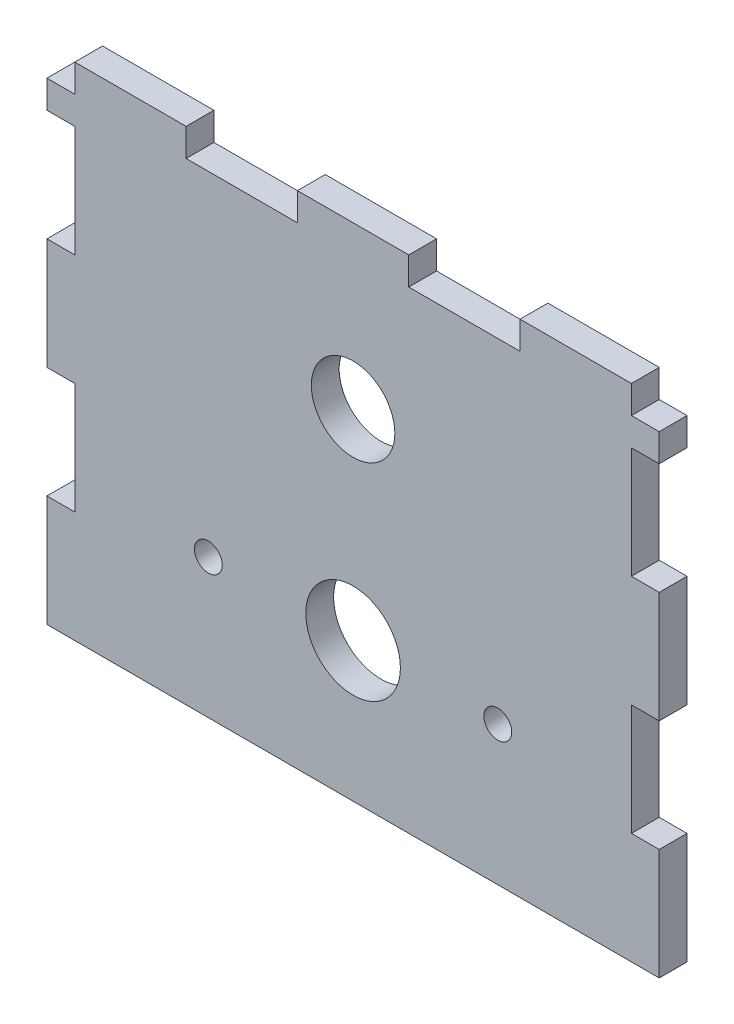
ISO-10303-21;
HEADER;
FILE_DESCRIPTION(('STEP AP214'),'2;1');
FILE_NAME('part.step','',(''),(''),'','','');
FILE_SCHEMA(('AUTOMOTIVE_DESIGN { 1 0 10303 214 1 1 1 1 }'));
ENDSEC;
DATA;
#1=APPLICATION_CONTEXT('core data for automotive mechanical design processes');
#2=APPLICATION_PROTOCOL_DEFINITION('international standard','automotive_design',2000,#1);
#3=PRODUCT_CONTEXT('',#1,'mechanical');
#4=PRODUCT('Part','Part','',(#3));
#5=PRODUCT_RELATED_PRODUCT_CATEGORY('part','',(#4));
#6=PRODUCT_DEFINITION_FORMATION('','',#4);
#7=PRODUCT_DEFINITION_CONTEXT('part definition',#1,'design');
#8=PRODUCT_DEFINITION('design','',#6,#7);
#9=PRODUCT_DEFINITION_SHAPE('','',#8);
#10=(LENGTH_UNIT() NAMED_UNIT(*) SI_UNIT(.MILLI.,.METRE.));
#11=(NAMED_UNIT(*) PLANE_ANGLE_UNIT() SI_UNIT($,.RADIAN.));
#12=(NAMED_UNIT(*) SI_UNIT($,.STERADIAN.) SOLID_ANGLE_UNIT());
#13=UNCERTAINTY_MEASURE_WITH_UNIT(LENGTH_MEASURE(1.E-05),#10,'distance_accuracy_value','');
#14=(GEOMETRIC_REPRESENTATION_CONTEXT(3) GLOBAL_UNCERTAINTY_ASSIGNED_CONTEXT((#13)) GLOBAL_UNIT_ASSIGNED_CONTEXT((#10,
#11,#12)) REPRESENTATION_CONTEXT('',''));
#15=CARTESIAN_POINT('',(0.,0.,0.));
#16=DIRECTION('',(0.,0.,1.));
#17=DIRECTION('',(1.,0.,0.));
#18=AXIS2_PLACEMENT_3D('',#15,#16,#17);
#19=CARTESIAN_POINT('',(-50.,42.5,5.));
#20=DIRECTION('',(1.,0.,0.));
#21=DIRECTION('',(0.,1.,0.));
#22=AXIS2_PLACEMENT_3D('',#19,#20,#21);
#23=PLANE('',#22);
#24=DIRECTION('',(0.,0.,1.));
#25=VECTOR('',#24,1.);
#26=CARTESIAN_POINT('',(-50.,42.5,-7.07106781186547));
#27=LINE('',#26,#25);
#28=CARTESIAN_POINT('',(-50.,42.5,0.));
#29=VERTEX_POINT('',#28);
#30=CARTESIAN_POINT('',(-50.,42.5,5.));
#31=VERTEX_POINT('',#30);
#32=EDGE_CURVE('E62',#29,#31,#27,.T.);
#33=ORIENTED_EDGE('',*,*,#32,.T.);
#34=DIRECTION('',(0.,-1.,0.));
#35=VECTOR('',#34,1.);
#36=CARTESIAN_POINT('',(-50.,42.5,5.));
#37=LINE('',#36,#35);
#38=CARTESIAN_POINT('',(-50.,47.5,5.));
#39=VERTEX_POINT('',#38);
#40=EDGE_CURVE('E46',#39,#31,#37,.T.);
#41=ORIENTED_EDGE('',*,*,#40,.F.);
#42=DIRECTION('',(0.,0.,1.));
#43=VECTOR('',#42,1.);
#44=CARTESIAN_POINT('',(-50.,47.5,-20.6155281280883));
#45=LINE('',#44,#43);
#46=CARTESIAN_POINT('',(-50.,47.5,0.));
#47=VERTEX_POINT('',#46);
#48=EDGE_CURVE('E314',#47,#39,#45,.T.);
#49=ORIENTED_EDGE('',*,*,#48,.F.);
#50=DIRECTION('',(0.,-1.,0.));
#51=VECTOR('',#50,1.);
#52=CARTESIAN_POINT('',(-50.,42.5,0.));
#53=LINE('',#52,#51);
#54=EDGE_CURVE('E503',#47,#29,#53,.T.);
#55=ORIENTED_EDGE('',*,*,#54,.T.);
#56=EDGE_LOOP('',(#33,#41,#49,#55));
#57=FACE_BOUND('',#56,.T.);
#58=ADVANCED_FACE('F37',(#57),#23,.F.);
#59=DIRECTION('',(0.,0.,1.));
#60=VECTOR('',#59,1.);
#61=CARTESIAN_POINT('',(-50.,37.5,-7.07106781186547));
#62=LINE('',#61,#60);
#63=CARTESIAN_POINT('',(-50.,37.5,0.));
#64=VERTEX_POINT('',#63);
#65=CARTESIAN_POINT('',(-50.,37.5,5.));
#66=VERTEX_POINT('',#65);
#67=EDGE_CURVE('E278',#64,#66,#62,.T.);
#68=ORIENTED_EDGE('',*,*,#67,.F.);
#69=CARTESIAN_POINT('',(-50.,17.5,0.));
#70=VERTEX_POINT('',#69);
#71=EDGE_CURVE('E504',#64,#70,#53,.T.);
#72=ORIENTED_EDGE('',*,*,#71,.T.);
#73=DIRECTION('',(0.,0.,1.));
#74=VECTOR('',#73,1.);
#75=CARTESIAN_POINT('',(-50.,17.5,-20.6155281280883));
#76=LINE('',#75,#74);
#77=CARTESIAN_POINT('',(-50.,17.5,5.));
#78=VERTEX_POINT('',#77);
#79=EDGE_CURVE('E413',#70,#78,#76,.T.);
#80=ORIENTED_EDGE('',*,*,#79,.T.);
#81=EDGE_CURVE('E54',#66,#78,#37,.T.);
#82=ORIENTED_EDGE('',*,*,#81,.F.);
#83=EDGE_LOOP('',(#68,#72,#80,#82));
#84=FACE_BOUND('',#83,.T.);
#85=ADVANCED_FACE('F524',(#84),#23,.F.);
#86=CARTESIAN_POINT('',(50.,42.5,5.));
#87=DIRECTION('',(-1.,0.,0.));
#88=DIRECTION('',(0.,0.,1.));
#89=AXIS2_PLACEMENT_3D('',#86,#87,#88);
#90=PLANE('',#89);
#91=DIRECTION('',(0.,1.,0.));
#92=VECTOR('',#91,1.);
#93=CARTESIAN_POINT('',(50.,42.5,5.));
#94=LINE('',#93,#92);
#95=CARTESIAN_POINT('',(50.,42.5,5.));
#96=VERTEX_POINT('',#95);
#97=CARTESIAN_POINT('',(50.,47.5,5.));
#98=VERTEX_POINT('',#97);
#99=EDGE_CURVE('E492',#96,#98,#94,.T.);
#100=ORIENTED_EDGE('',*,*,#99,.F.);
#101=DIRECTION('',(0.,0.,1.));
#102=VECTOR('',#101,1.);
#103=CARTESIAN_POINT('',(50.,42.5,-7.07106781186547));
#104=LINE('',#103,#102);
#105=CARTESIAN_POINT('',(50.,42.5,0.));
#106=VERTEX_POINT('',#105);
#107=EDGE_CURVE('E287',#106,#96,#104,.T.);
#108=ORIENTED_EDGE('',*,*,#107,.F.);
#109=DIRECTION('',(0.,1.,0.));
#110=VECTOR('',#109,1.);
#111=CARTESIAN_POINT('',(50.,42.5,0.));
#112=LINE('',#111,#110);
#113=CARTESIAN_POINT('',(50.,47.5,0.));
#114=VERTEX_POINT('',#113);
#115=EDGE_CURVE('E484',#106,#114,#112,.T.);
#116=ORIENTED_EDGE('',*,*,#115,.T.);
#117=DIRECTION('',(0.,0.,1.));
#118=VECTOR('',#117,1.);
#119=CARTESIAN_POINT('',(50.,47.5,-20.6155281280883));
#120=LINE('',#119,#118);
#121=EDGE_CURVE('E341',#114,#98,#120,.T.);
#122=ORIENTED_EDGE('',*,*,#121,.T.);
#123=EDGE_LOOP('',(#100,#108,#116,#122));
#124=FACE_BOUND('',#123,.T.);
#125=ADVANCED_FACE('F548',(#124),#90,.F.);
#126=CARTESIAN_POINT('',(-50.,42.5,5.));
#127=DIRECTION('',(0.,-1.,0.));
#128=DIRECTION('',(1.,0.,0.));
#129=AXIS2_PLACEMENT_3D('',#126,#127,#128);
#130=PLANE('',#129);
#131=DIRECTION('',(-1.,0.,0.));
#132=VECTOR('',#131,1.);
#133=CARTESIAN_POINT('',(-50.,42.5,0.));
#134=LINE('',#133,#132);
#135=CARTESIAN_POINT('',(-10.,42.5,0.));
#136=VERTEX_POINT('',#135);
#137=CARTESIAN_POINT('',(-30.,42.5,0.));
#138=VERTEX_POINT('',#137);
#139=EDGE_CURVE('E499',#136,#138,#134,.T.);
#140=ORIENTED_EDGE('',*,*,#139,.T.);
#141=DIRECTION('',(0.,0.,1.));
#142=VECTOR('',#141,1.);
#143=CARTESIAN_POINT('',(-30.,42.5,-20.6155281280883));
#144=LINE('',#143,#142);
#145=CARTESIAN_POINT('',(-30.,42.5,5.));
#146=VERTEX_POINT('',#145);
#147=EDGE_CURVE('E321',#138,#146,#144,.T.);
#148=ORIENTED_EDGE('',*,*,#147,.T.);
#149=DIRECTION('',(-1.,0.,0.));
#150=VECTOR('',#149,1.);
#151=CARTESIAN_POINT('',(-50.,42.5,5.));
#152=LINE('',#151,#150);
#153=CARTESIAN_POINT('',(-10.,42.5,5.));
#154=VERTEX_POINT('',#153);
#155=EDGE_CURVE('E490',#154,#146,#152,.T.);
#156=ORIENTED_EDGE('',*,*,#155,.F.);
#157=DIRECTION('',(0.,0.,1.));
#158=VECTOR('',#157,1.);
#159=CARTESIAN_POINT('',(-10.,42.5,-20.6155281280883));
#160=LINE('',#159,#158);
#161=EDGE_CURVE('E363',#136,#154,#160,.T.);
#162=ORIENTED_EDGE('',*,*,#161,.F.);
#163=EDGE_LOOP('',(#140,#148,#156,#162));
#164=FACE_BOUND('',#163,.T.);
#165=ADVANCED_FACE('F557',(#164),#130,.F.);
#166=CARTESIAN_POINT('',(50.,17.5,0.));
#167=VERTEX_POINT('',#166);
#168=CARTESIAN_POINT('',(50.,37.5,0.));
#169=VERTEX_POINT('',#168);
#170=EDGE_CURVE('E500',#167,#169,#112,.T.);
#171=ORIENTED_EDGE('',*,*,#170,.T.);
#172=DIRECTION('',(0.,0.,1.));
#173=VECTOR('',#172,1.);
#174=CARTESIAN_POINT('',(50.,37.5,-7.07106781186547));
#175=LINE('',#174,#173);
#176=CARTESIAN_POINT('',(50.,37.5,5.));
#177=VERTEX_POINT('',#176);
#178=EDGE_CURVE('E299',#169,#177,#175,.T.);
#179=ORIENTED_EDGE('',*,*,#178,.T.);
#180=CARTESIAN_POINT('',(50.,17.5,5.));
#181=VERTEX_POINT('',#180);
#182=EDGE_CURVE('E491',#181,#177,#94,.T.);
#183=ORIENTED_EDGE('',*,*,#182,.F.);
#184=DIRECTION('',(0.,0.,1.));
#185=VECTOR('',#184,1.);
#186=CARTESIAN_POINT('',(50.,17.5,-20.6155281280883));
#187=LINE('',#186,#185);
#188=EDGE_CURVE('E375',#167,#181,#187,.T.);
#189=ORIENTED_EDGE('',*,*,#188,.F.);
#190=EDGE_LOOP('',(#171,#179,#183,#189));
#191=FACE_BOUND('',#190,.T.);
#192=ADVANCED_FACE('F551',(#191),#90,.F.);
#193=DIRECTION('',(0.,0.,1.));
#194=VECTOR('',#193,1.);
#195=CARTESIAN_POINT('',(-50.,-2.50000000000001,-20.6155281280883));
#196=LINE('',#195,#194);
#197=CARTESIAN_POINT('',(-50.,-2.50000000000001,0.));
#198=VERTEX_POINT('',#197);
#199=CARTESIAN_POINT('',(-50.,-2.50000000000001,5.));
#200=VERTEX_POINT('',#199);
#201=EDGE_CURVE('E414',#198,#200,#196,.T.);
#202=ORIENTED_EDGE('',*,*,#201,.F.);
#203=CARTESIAN_POINT('',(-50.,-22.5,0.));
#204=VERTEX_POINT('',#203);
#205=EDGE_CURVE('E502',#198,#204,#53,.T.);
#206=ORIENTED_EDGE('',*,*,#205,.T.);
#207=DIRECTION('',(0.,0.,1.));
#208=VECTOR('',#207,1.);
#209=CARTESIAN_POINT('',(-50.,-22.5,-20.6155281280883));
#210=LINE('',#209,#208);
#211=CARTESIAN_POINT('',(-50.,-22.5,5.));
#212=VERTEX_POINT('',#211);
#213=EDGE_CURVE('E434',#204,#212,#210,.T.);
#214=ORIENTED_EDGE('',*,*,#213,.T.);
#215=EDGE_CURVE('E495',#200,#212,#37,.T.);
#216=ORIENTED_EDGE('',*,*,#215,.F.);
#217=EDGE_LOOP('',(#202,#206,#214,#216));
#218=FACE_BOUND('',#217,.T.);
#219=ADVANCED_FACE('F509',(#218),#23,.F.);
#220=CARTESIAN_POINT('',(50.,-22.5,0.));
#221=VERTEX_POINT('',#220);
#222=CARTESIAN_POINT('',(50.,-2.50000000000001,0.));
#223=VERTEX_POINT('',#222);
#224=EDGE_CURVE('E497',#221,#223,#112,.T.);
#225=ORIENTED_EDGE('',*,*,#224,.T.);
#226=DIRECTION('',(0.,0.,1.));
#227=VECTOR('',#226,1.);
#228=CARTESIAN_POINT('',(50.,-2.50000000000001,-20.6155281280883));
#229=LINE('',#228,#227);
#230=CARTESIAN_POINT('',(50.,-2.50000000000001,5.));
#231=VERTEX_POINT('',#230);
#232=EDGE_CURVE('E386',#223,#231,#229,.T.);
#233=ORIENTED_EDGE('',*,*,#232,.T.);
#234=CARTESIAN_POINT('',(50.,-22.5,5.));
#235=VERTEX_POINT('',#234);
#236=EDGE_CURVE('E487',#235,#231,#94,.T.);
#237=ORIENTED_EDGE('',*,*,#236,.F.);
#238=DIRECTION('',(0.,0.,1.));
#239=VECTOR('',#238,1.);
#240=CARTESIAN_POINT('',(50.,-22.5,-20.6155281280883));
#241=LINE('',#240,#239);
#242=EDGE_CURVE('E448',#221,#235,#241,.T.);
#243=ORIENTED_EDGE('',*,*,#242,.F.);
#244=EDGE_LOOP('',(#225,#233,#237,#243));
#245=FACE_BOUND('',#244,.T.);
#246=ADVANCED_FACE('F39',(#245),#90,.F.);
#247=CARTESIAN_POINT('',(0.,0.,5.));
#248=DIRECTION('',(0.,0.,1.));
#249=DIRECTION('',(1.,0.,0.));
#250=AXIS2_PLACEMENT_3D('',#247,#248,#249);
#251=PLANE('',#250);
#252=CARTESIAN_POINT('',(26.,-17.5,5.));
#253=DIRECTION('',(0.,0.,1.));
#254=DIRECTION('',(1.,0.,0.));
#255=AXIS2_PLACEMENT_3D('',#252,#253,#254);
#256=CIRCLE('',#255,2.5);
#257=CARTESIAN_POINT('',(28.5,-17.5,5.));
#258=VERTEX_POINT('',#257);
#259=EDGE_CURVE('E469',#258,#258,#256,.T.);
#260=ORIENTED_EDGE('',*,*,#259,.F.);
#261=EDGE_LOOP('',(#260));
#262=FACE_BOUND('',#261,.T.);
#263=CARTESIAN_POINT('',(0.,-17.5,5.));
#264=DIRECTION('',(0.,0.,1.));
#265=DIRECTION('',(1.,0.,0.));
#266=AXIS2_PLACEMENT_3D('',#263,#264,#265);
#267=CIRCLE('',#266,8.5);
#268=CARTESIAN_POINT('',(8.50000000000001,-17.5,5.));
#269=VERTEX_POINT('',#268);
#270=EDGE_CURVE('E481',#269,#269,#267,.T.);
#271=ORIENTED_EDGE('',*,*,#270,.F.);
#272=EDGE_LOOP('',(#271));
#273=FACE_BOUND('',#272,.T.);
#274=DIRECTION('',(1.,0.,0.));
#275=VECTOR('',#274,1.);
#276=CARTESIAN_POINT('',(-50.,-42.5,5.));
#277=LINE('',#276,#275);
#278=CARTESIAN_POINT('',(-55.,-42.5,5.));
#279=VERTEX_POINT('',#278);
#280=CARTESIAN_POINT('',(55.,-42.5,5.));
#281=VERTEX_POINT('',#280);
#282=EDGE_CURVE('E11',#279,#281,#277,.T.);
#283=ORIENTED_EDGE('',*,*,#282,.T.);
#284=DIRECTION('',(0.,1.,0.));
#285=VECTOR('',#284,1.);
#286=CARTESIAN_POINT('',(55.,-42.5,5.));
#287=LINE('',#286,#285);
#288=CARTESIAN_POINT('',(55.,-22.5,5.));
#289=VERTEX_POINT('',#288);
#290=EDGE_CURVE('E427',#281,#289,#287,.T.);
#291=ORIENTED_EDGE('',*,*,#290,.T.);
#292=DIRECTION('',(-1.,0.,0.));
#293=VECTOR('',#292,1.);
#294=CARTESIAN_POINT('',(50.,-22.5,5.));
#295=LINE('',#294,#293);
#296=EDGE_CURVE('E453',#289,#235,#295,.T.);
#297=ORIENTED_EDGE('',*,*,#296,.T.);
#298=ORIENTED_EDGE('',*,*,#236,.T.);
#299=DIRECTION('',(1.,0.,0.));
#300=VECTOR('',#299,1.);
#301=CARTESIAN_POINT('',(50.,-2.50000000000001,5.));
#302=LINE('',#301,#300);
#303=CARTESIAN_POINT('',(55.,-2.50000000000001,5.));
#304=VERTEX_POINT('',#303);
#305=EDGE_CURVE('E354',#231,#304,#302,.T.);
#306=ORIENTED_EDGE('',*,*,#305,.T.);
#307=DIRECTION('',(0.,1.,0.));
#308=VECTOR('',#307,1.);
#309=CARTESIAN_POINT('',(55.,-2.50000000000001,5.));
#310=LINE('',#309,#308);
#311=CARTESIAN_POINT('',(55.,17.5,5.));
#312=VERTEX_POINT('',#311);
#313=EDGE_CURVE('E380',#304,#312,#310,.T.);
#314=ORIENTED_EDGE('',*,*,#313,.T.);
#315=DIRECTION('',(-1.,0.,0.));
#316=VECTOR('',#315,1.);
#317=CARTESIAN_POINT('',(50.,17.5,5.));
#318=LINE('',#317,#316);
#319=EDGE_CURVE('E383',#312,#181,#318,.T.);
#320=ORIENTED_EDGE('',*,*,#319,.T.);
#321=ORIENTED_EDGE('',*,*,#182,.T.);
#322=DIRECTION('',(1.,0.,0.));
#323=VECTOR('',#322,1.);
#324=CARTESIAN_POINT('',(50.,37.5,5.));
#325=LINE('',#324,#323);
#326=CARTESIAN_POINT('',(55.,37.5,5.));
#327=VERTEX_POINT('',#326);
#328=EDGE_CURVE('E290',#177,#327,#325,.T.);
#329=ORIENTED_EDGE('',*,*,#328,.T.);
#330=DIRECTION('',(0.,1.,0.));
#331=VECTOR('',#330,1.);
#332=CARTESIAN_POINT('',(55.,42.5,5.));
#333=LINE('',#332,#331);
#334=CARTESIAN_POINT('',(55.,42.5,5.));
#335=VERTEX_POINT('',#334);
#336=EDGE_CURVE('E293',#327,#335,#333,.T.);
#337=ORIENTED_EDGE('',*,*,#336,.T.);
#338=DIRECTION('',(-1.,0.,0.));
#339=VECTOR('',#338,1.);
#340=CARTESIAN_POINT('',(50.,42.5,5.));
#341=LINE('',#340,#339);
#342=EDGE_CURVE('E296',#335,#96,#341,.T.);
#343=ORIENTED_EDGE('',*,*,#342,.T.);
#344=ORIENTED_EDGE('',*,*,#99,.T.);
#345=DIRECTION('',(-1.,0.,0.));
#346=VECTOR('',#345,1.);
#347=CARTESIAN_POINT('',(30.,47.5,5.));
#348=LINE('',#347,#346);
#349=CARTESIAN_POINT('',(30.,47.5,5.));
#350=VERTEX_POINT('',#349);
#351=EDGE_CURVE('E336',#98,#350,#348,.T.);
#352=ORIENTED_EDGE('',*,*,#351,.T.);
#353=DIRECTION('',(0.,-1.,0.));
#354=VECTOR('',#353,1.);
#355=CARTESIAN_POINT('',(30.,42.5,5.));
#356=LINE('',#355,#354);
#357=CARTESIAN_POINT('',(30.,42.5,5.));
#358=VERTEX_POINT('',#357);
#359=EDGE_CURVE('E316',#350,#358,#356,.T.);
#360=ORIENTED_EDGE('',*,*,#359,.T.);
#361=CARTESIAN_POINT('',(10.,42.5,5.));
#362=VERTEX_POINT('',#361);
#363=EDGE_CURVE('E493',#358,#362,#152,.T.);
#364=ORIENTED_EDGE('',*,*,#363,.T.);
#365=DIRECTION('',(0.,1.,0.));
#366=VECTOR('',#365,1.);
#367=CARTESIAN_POINT('',(10.,42.5,5.));
#368=LINE('',#367,#366);
#369=CARTESIAN_POINT('',(10.,47.5,5.));
#370=VERTEX_POINT('',#369);
#371=EDGE_CURVE('E357',#362,#370,#368,.T.);
#372=ORIENTED_EDGE('',*,*,#371,.T.);
#373=DIRECTION('',(-1.,0.,0.));
#374=VECTOR('',#373,1.);
#375=CARTESIAN_POINT('',(-10.,47.5,5.));
#376=LINE('',#375,#374);
#377=CARTESIAN_POINT('',(-10.,47.5,5.));
#378=VERTEX_POINT('',#377);
#379=EDGE_CURVE('E360',#370,#378,#376,.T.);
#380=ORIENTED_EDGE('',*,*,#379,.T.);
#381=DIRECTION('',(0.,-1.,0.));
#382=VECTOR('',#381,1.);
#383=CARTESIAN_POINT('',(-10.,42.5,5.));
#384=LINE('',#383,#382);
#385=EDGE_CURVE('E333',#378,#154,#384,.T.);
#386=ORIENTED_EDGE('',*,*,#385,.T.);
#387=ORIENTED_EDGE('',*,*,#155,.T.);
#388=DIRECTION('',(0.,1.,0.));
#389=VECTOR('',#388,1.);
#390=CARTESIAN_POINT('',(-30.,42.5,5.));
#391=LINE('',#390,#389);
#392=CARTESIAN_POINT('',(-30.,47.5,5.));
#393=VERTEX_POINT('',#392);
#394=EDGE_CURVE('E309',#146,#393,#391,.T.);
#395=ORIENTED_EDGE('',*,*,#394,.T.);
#396=DIRECTION('',(-1.,0.,0.));
#397=VECTOR('',#396,1.);
#398=CARTESIAN_POINT('',(-50.,47.5,5.));
#399=LINE('',#398,#397);
#400=EDGE_CURVE('E319',#393,#39,#399,.T.);
#401=ORIENTED_EDGE('',*,*,#400,.T.);
#402=ORIENTED_EDGE('',*,*,#40,.T.);
#403=DIRECTION('',(1.,0.,0.));
#404=VECTOR('',#403,1.);
#405=CARTESIAN_POINT('',(-50.,42.5,5.));
#406=LINE('',#405,#404);
#407=CARTESIAN_POINT('',(-55.,42.5,5.));
#408=VERTEX_POINT('',#407);
#409=EDGE_CURVE('E253',#408,#31,#406,.T.);
#410=ORIENTED_EDGE('',*,*,#409,.F.);
#411=DIRECTION('',(0.,1.,0.));
#412=VECTOR('',#411,1.);
#413=CARTESIAN_POINT('',(-55.,42.5,5.));
#414=LINE('',#413,#412);
#415=CARTESIAN_POINT('',(-55.,37.5,5.));
#416=VERTEX_POINT('',#415);
#417=EDGE_CURVE('E261',#416,#408,#414,.T.);
#418=ORIENTED_EDGE('',*,*,#417,.F.);
#419=DIRECTION('',(-1.,0.,0.));
#420=VECTOR('',#419,1.);
#421=CARTESIAN_POINT('',(-50.,37.5,5.));
#422=LINE('',#421,#420);
#423=EDGE_CURVE('E267',#66,#416,#422,.T.);
#424=ORIENTED_EDGE('',*,*,#423,.F.);
#425=ORIENTED_EDGE('',*,*,#81,.T.);
#426=DIRECTION('',(1.,0.,0.));
#427=VECTOR('',#426,1.);
#428=CARTESIAN_POINT('',(-50.,17.5,5.));
#429=LINE('',#428,#427);
#430=CARTESIAN_POINT('',(-55.,17.5,5.));
#431=VERTEX_POINT('',#430);
#432=EDGE_CURVE('E396',#431,#78,#429,.T.);
#433=ORIENTED_EDGE('',*,*,#432,.F.);
#434=DIRECTION('',(0.,1.,0.));
#435=VECTOR('',#434,1.);
#436=CARTESIAN_POINT('',(-55.,-2.50000000000001,5.));
#437=LINE('',#436,#435);
#438=CARTESIAN_POINT('',(-55.,-2.50000000000001,5.));
#439=VERTEX_POINT('',#438);
#440=EDGE_CURVE('E407',#439,#431,#437,.T.);
#441=ORIENTED_EDGE('',*,*,#440,.F.);
#442=DIRECTION('',(-1.,0.,0.));
#443=VECTOR('',#442,1.);
#444=CARTESIAN_POINT('',(-50.,-2.50000000000001,5.));
#445=LINE('',#444,#443);
#446=EDGE_CURVE('E410',#200,#439,#445,.T.);
#447=ORIENTED_EDGE('',*,*,#446,.F.);
#448=ORIENTED_EDGE('',*,*,#215,.T.);
#449=DIRECTION('',(1.,0.,0.));
#450=VECTOR('',#449,1.);
#451=CARTESIAN_POINT('',(-50.,-22.5,5.));
#452=LINE('',#451,#450);
#453=CARTESIAN_POINT('',(-55.,-22.5,5.));
#454=VERTEX_POINT('',#453);
#455=EDGE_CURVE('E404',#454,#212,#452,.T.);
#456=ORIENTED_EDGE('',*,*,#455,.F.);
#457=DIRECTION('',(0.,1.,0.));
#458=VECTOR('',#457,1.);
#459=CARTESIAN_POINT('',(-55.,-42.5,5.));
#460=LINE('',#459,#458);
#461=EDGE_CURVE('E431',#279,#454,#460,.T.);
#462=ORIENTED_EDGE('',*,*,#461,.F.);
#463=EDGE_LOOP('',(#283,#291,#297,#298,#306,#314,#320,#321,#329,#337,#343,#344,#352,#360,#364,
#372,#380,#386,#387,#395,#401,#402,#410,#418,#424,#425,#433,#441,#447,#448,#456,#462));
#464=FACE_BOUND('',#463,.T.);
#465=CARTESIAN_POINT('',(-26.,-17.5,5.));
#466=DIRECTION('',(0.,0.,1.));
#467=DIRECTION('',(1.,0.,0.));
#468=AXIS2_PLACEMENT_3D('',#465,#466,#467);
#469=CIRCLE('',#468,2.5);
#470=CARTESIAN_POINT('',(-23.5,-17.5,5.));
#471=VERTEX_POINT('',#470);
#472=EDGE_CURVE('E475',#471,#471,#469,.T.);
#473=ORIENTED_EDGE('',*,*,#472,.F.);
#474=EDGE_LOOP('',(#473));
#475=FACE_BOUND('',#474,.T.);
#476=CARTESIAN_POINT('',(0.,18.5,5.));
#477=DIRECTION('',(0.,0.,1.));
#478=DIRECTION('',(1.,0.,0.));
#479=AXIS2_PLACEMENT_3D('',#476,#477,#478);
#480=CIRCLE('',#479,7.5);
#481=CARTESIAN_POINT('',(7.50000000000001,18.5,5.));
#482=VERTEX_POINT('',#481);
#483=EDGE_CURVE('E463',#482,#482,#480,.T.);
#484=ORIENTED_EDGE('',*,*,#483,.F.);
#485=EDGE_LOOP('',(#484));
#486=FACE_BOUND('',#485,.T.);
#487=ADVANCED_FACE('F269',(#262,#273,#464,#475,#486),#251,.T.);
#488=CARTESIAN_POINT('',(0.,0.,0.));
#489=DIRECTION('',(0.,0.,1.));
#490=DIRECTION('',(1.,0.,0.));
#491=AXIS2_PLACEMENT_3D('',#488,#489,#490);
#492=PLANE('',#491);
#493=ORIENTED_EDGE('',*,*,#224,.F.);
#494=DIRECTION('',(1.,0.,0.));
#495=VECTOR('',#494,1.);
#496=CARTESIAN_POINT('',(50.,-22.5,0.));
#497=LINE('',#496,#495);
#498=CARTESIAN_POINT('',(55.,-22.5,0.));
#499=VERTEX_POINT('',#498);
#500=EDGE_CURVE('E447',#221,#499,#497,.T.);
#501=ORIENTED_EDGE('',*,*,#500,.T.);
#502=DIRECTION('',(0.,-1.,0.));
#503=VECTOR('',#502,1.);
#504=CARTESIAN_POINT('',(55.,-42.5,0.));
#505=LINE('',#504,#503);
#506=CARTESIAN_POINT('',(55.,-42.5,0.));
#507=VERTEX_POINT('',#506);
#508=EDGE_CURVE('E444',#499,#507,#505,.T.);
#509=ORIENTED_EDGE('',*,*,#508,.T.);
#510=DIRECTION('',(1.,0.,0.));
#511=VECTOR('',#510,1.);
#512=CARTESIAN_POINT('',(-50.,-42.5,0.));
#513=LINE('',#512,#511);
#514=CARTESIAN_POINT('',(-55.,-42.5,0.));
#515=VERTEX_POINT('',#514);
#516=EDGE_CURVE('E41',#515,#507,#513,.T.);
#517=ORIENTED_EDGE('',*,*,#516,.F.);
#518=DIRECTION('',(0.,-1.,0.));
#519=VECTOR('',#518,1.);
#520=CARTESIAN_POINT('',(-55.,-42.5,0.));
#521=LINE('',#520,#519);
#522=CARTESIAN_POINT('',(-55.,-22.5,0.));
#523=VERTEX_POINT('',#522);
#524=EDGE_CURVE('E424',#523,#515,#521,.T.);
#525=ORIENTED_EDGE('',*,*,#524,.F.);
#526=DIRECTION('',(-1.,0.,0.));
#527=VECTOR('',#526,1.);
#528=CARTESIAN_POINT('',(-50.,-22.5,0.));
#529=LINE('',#528,#527);
#530=EDGE_CURVE('E428',#204,#523,#529,.T.);
#531=ORIENTED_EDGE('',*,*,#530,.F.);
#532=ORIENTED_EDGE('',*,*,#205,.F.);
#533=DIRECTION('',(1.,0.,0.));
#534=VECTOR('',#533,1.);
#535=CARTESIAN_POINT('',(-50.,-2.50000000000001,0.));
#536=LINE('',#535,#534);
#537=CARTESIAN_POINT('',(-55.,-2.50000000000001,0.));
#538=VERTEX_POINT('',#537);
#539=EDGE_CURVE('E400',#538,#198,#536,.T.);
#540=ORIENTED_EDGE('',*,*,#539,.F.);
#541=DIRECTION('',(0.,-1.,0.));
#542=VECTOR('',#541,1.);
#543=CARTESIAN_POINT('',(-55.,-2.50000000000001,0.));
#544=LINE('',#543,#542);
#545=CARTESIAN_POINT('',(-55.,17.5,0.));
#546=VERTEX_POINT('',#545);
#547=EDGE_CURVE('E397',#546,#538,#544,.T.);
#548=ORIENTED_EDGE('',*,*,#547,.F.);
#549=DIRECTION('',(-1.,0.,0.));
#550=VECTOR('',#549,1.);
#551=CARTESIAN_POINT('',(-50.,17.5,0.));
#552=LINE('',#551,#550);
#553=EDGE_CURVE('E401',#70,#546,#552,.T.);
#554=ORIENTED_EDGE('',*,*,#553,.F.);
#555=ORIENTED_EDGE('',*,*,#71,.F.);
#556=DIRECTION('',(1.,0.,0.));
#557=VECTOR('',#556,1.);
#558=CARTESIAN_POINT('',(-50.,37.5,0.));
#559=LINE('',#558,#557);
#560=CARTESIAN_POINT('',(-55.,37.5,0.));
#561=VERTEX_POINT('',#560);
#562=EDGE_CURVE('E274',#561,#64,#559,.T.);
#563=ORIENTED_EDGE('',*,*,#562,.F.);
#564=DIRECTION('',(0.,-1.,0.));
#565=VECTOR('',#564,1.);
#566=CARTESIAN_POINT('',(-55.,42.5,0.));
#567=LINE('',#566,#565);
#568=CARTESIAN_POINT('',(-55.,42.5,0.));
#569=VERTEX_POINT('',#568);
#570=EDGE_CURVE('E283',#569,#561,#567,.T.);
#571=ORIENTED_EDGE('',*,*,#570,.F.);
#572=DIRECTION('',(-1.,0.,0.));
#573=VECTOR('',#572,1.);
#574=CARTESIAN_POINT('',(-50.,42.5,0.));
#575=LINE('',#574,#573);
#576=EDGE_CURVE('E255',#29,#569,#575,.T.);
#577=ORIENTED_EDGE('',*,*,#576,.F.);
#578=ORIENTED_EDGE('',*,*,#54,.F.);
#579=DIRECTION('',(1.,0.,0.));
#580=VECTOR('',#579,1.);
#581=CARTESIAN_POINT('',(-50.,47.5,0.));
#582=LINE('',#581,#580);
#583=CARTESIAN_POINT('',(-30.,47.5,0.));
#584=VERTEX_POINT('',#583);
#585=EDGE_CURVE('E313',#47,#584,#582,.T.);
#586=ORIENTED_EDGE('',*,*,#585,.T.);
#587=DIRECTION('',(0.,-1.,0.));
#588=VECTOR('',#587,1.);
#589=CARTESIAN_POINT('',(-30.,42.5,0.));
#590=LINE('',#589,#588);
#591=EDGE_CURVE('E310',#584,#138,#590,.T.);
#592=ORIENTED_EDGE('',*,*,#591,.T.);
#593=ORIENTED_EDGE('',*,*,#139,.F.);
#594=DIRECTION('',(0.,1.,0.));
#595=VECTOR('',#594,1.);
#596=CARTESIAN_POINT('',(-10.,42.5,0.));
#597=LINE('',#596,#595);
#598=CARTESIAN_POINT('',(-10.,47.5,0.));
#599=VERTEX_POINT('',#598);
#600=EDGE_CURVE('E352',#136,#599,#597,.T.);
#601=ORIENTED_EDGE('',*,*,#600,.T.);
#602=DIRECTION('',(1.,0.,0.));
#603=VECTOR('',#602,1.);
#604=CARTESIAN_POINT('',(-10.,47.5,0.));
#605=LINE('',#604,#603);
#606=CARTESIAN_POINT('',(10.,47.5,0.));
#607=VERTEX_POINT('',#606);
#608=EDGE_CURVE('E349',#599,#607,#605,.T.);
#609=ORIENTED_EDGE('',*,*,#608,.T.);
#610=DIRECTION('',(0.,-1.,0.));
#611=VECTOR('',#610,1.);
#612=CARTESIAN_POINT('',(10.,42.5,0.));
#613=LINE('',#612,#611);
#614=CARTESIAN_POINT('',(10.,42.5,0.));
#615=VERTEX_POINT('',#614);
#616=EDGE_CURVE('E346',#607,#615,#613,.T.);
#617=ORIENTED_EDGE('',*,*,#616,.T.);
#618=CARTESIAN_POINT('',(30.,42.5,0.));
#619=VERTEX_POINT('',#618);
#620=EDGE_CURVE('E501',#619,#615,#134,.T.);
#621=ORIENTED_EDGE('',*,*,#620,.F.);
#622=DIRECTION('',(0.,1.,0.));
#623=VECTOR('',#622,1.);
#624=CARTESIAN_POINT('',(30.,42.5,0.));
#625=LINE('',#624,#623);
#626=CARTESIAN_POINT('',(30.,47.5,0.));
#627=VERTEX_POINT('',#626);
#628=EDGE_CURVE('E330',#619,#627,#625,.T.);
#629=ORIENTED_EDGE('',*,*,#628,.T.);
#630=DIRECTION('',(1.,0.,0.));
#631=VECTOR('',#630,1.);
#632=CARTESIAN_POINT('',(30.,47.5,0.));
#633=LINE('',#632,#631);
#634=EDGE_CURVE('E327',#627,#114,#633,.T.);
#635=ORIENTED_EDGE('',*,*,#634,.T.);
#636=ORIENTED_EDGE('',*,*,#115,.F.);
#637=DIRECTION('',(1.,0.,0.));
#638=VECTOR('',#637,1.);
#639=CARTESIAN_POINT('',(50.,42.5,0.));
#640=LINE('',#639,#638);
#641=CARTESIAN_POINT('',(55.,42.5,0.));
#642=VERTEX_POINT('',#641);
#643=EDGE_CURVE('E286',#106,#642,#640,.T.);
#644=ORIENTED_EDGE('',*,*,#643,.T.);
#645=DIRECTION('',(0.,-1.,0.));
#646=VECTOR('',#645,1.);
#647=CARTESIAN_POINT('',(55.,42.5,0.));
#648=LINE('',#647,#646);
#649=CARTESIAN_POINT('',(55.,37.5,0.));
#650=VERTEX_POINT('',#649);
#651=EDGE_CURVE('E284',#642,#650,#648,.T.);
#652=ORIENTED_EDGE('',*,*,#651,.T.);
#653=DIRECTION('',(-1.,0.,0.));
#654=VECTOR('',#653,1.);
#655=CARTESIAN_POINT('',(50.,37.5,0.));
#656=LINE('',#655,#654);
#657=EDGE_CURVE('E289',#650,#169,#656,.T.);
#658=ORIENTED_EDGE('',*,*,#657,.T.);
#659=ORIENTED_EDGE('',*,*,#170,.F.);
#660=DIRECTION('',(1.,0.,0.));
#661=VECTOR('',#660,1.);
#662=CARTESIAN_POINT('',(50.,17.5,0.));
#663=LINE('',#662,#661);
#664=CARTESIAN_POINT('',(55.,17.5,0.));
#665=VERTEX_POINT('',#664);
#666=EDGE_CURVE('E374',#167,#665,#663,.T.);
#667=ORIENTED_EDGE('',*,*,#666,.T.);
#668=DIRECTION('',(0.,-1.,0.));
#669=VECTOR('',#668,1.);
#670=CARTESIAN_POINT('',(55.,-2.50000000000001,0.));
#671=LINE('',#670,#669);
#672=CARTESIAN_POINT('',(55.,-2.50000000000001,0.));
#673=VERTEX_POINT('',#672);
#674=EDGE_CURVE('E372',#665,#673,#671,.T.);
#675=ORIENTED_EDGE('',*,*,#674,.T.);
#676=DIRECTION('',(-1.,0.,0.));
#677=VECTOR('',#676,1.);
#678=CARTESIAN_POINT('',(50.,-2.50000000000001,0.));
#679=LINE('',#678,#677);
#680=EDGE_CURVE('E377',#673,#223,#679,.T.);
#681=ORIENTED_EDGE('',*,*,#680,.T.);
#682=EDGE_LOOP('',(#493,#501,#509,#517,#525,#531,#532,#540,#548,#554,#555,#563,#571,#577,#578,
#586,#592,#593,#601,#609,#617,#621,#629,#635,#636,#644,#652,#658,#659,#667,#675,#681));
#683=FACE_BOUND('',#682,.T.);
#684=CARTESIAN_POINT('',(0.,-17.5,0.));
#685=DIRECTION('',(0.,0.,1.));
#686=DIRECTION('',(1.,0.,0.));
#687=AXIS2_PLACEMENT_3D('',#684,#685,#686);
#688=CIRCLE('',#687,8.5);
#689=CARTESIAN_POINT('',(8.50000000000001,-17.5,0.));
#690=VERTEX_POINT('',#689);
#691=EDGE_CURVE('E478',#690,#690,#688,.T.);
#692=ORIENTED_EDGE('',*,*,#691,.T.);
#693=EDGE_LOOP('',(#692));
#694=FACE_BOUND('',#693,.T.);
#695=CARTESIAN_POINT('',(-26.,-17.5,0.));
#696=DIRECTION('',(0.,0.,1.));
#697=DIRECTION('',(1.,0.,0.));
#698=AXIS2_PLACEMENT_3D('',#695,#696,#697);
#699=CIRCLE('',#698,2.5);
#700=CARTESIAN_POINT('',(-23.5,-17.5,0.));
#701=VERTEX_POINT('',#700);
#702=EDGE_CURVE('E472',#701,#701,#699,.T.);
#703=ORIENTED_EDGE('',*,*,#702,.T.);
#704=EDGE_LOOP('',(#703));
#705=FACE_BOUND('',#704,.T.);
#706=CARTESIAN_POINT('',(26.,-17.5,0.));
#707=DIRECTION('',(0.,0.,1.));
#708=DIRECTION('',(1.,0.,0.));
#709=AXIS2_PLACEMENT_3D('',#706,#707,#708);
#710=CIRCLE('',#709,2.5);
#711=CARTESIAN_POINT('',(28.5,-17.5,0.));
#712=VERTEX_POINT('',#711);
#713=EDGE_CURVE('E466',#712,#712,#710,.T.);
#714=ORIENTED_EDGE('',*,*,#713,.T.);
#715=EDGE_LOOP('',(#714));
#716=FACE_BOUND('',#715,.T.);
#717=CARTESIAN_POINT('',(0.,18.5,0.));
#718=DIRECTION('',(0.,0.,1.));
#719=DIRECTION('',(1.,0.,0.));
#720=AXIS2_PLACEMENT_3D('',#717,#718,#719);
#721=CIRCLE('',#720,7.5);
#722=CARTESIAN_POINT('',(7.50000000000001,18.5,0.));
#723=VERTEX_POINT('',#722);
#724=EDGE_CURVE('E450',#723,#723,#721,.T.);
#725=ORIENTED_EDGE('',*,*,#724,.T.);
#726=EDGE_LOOP('',(#725));
#727=FACE_BOUND('',#726,.T.);
#728=ADVANCED_FACE('F513',(#683,#694,#705,#716,#727),#492,.F.);
#729=ORIENTED_EDGE('',*,*,#363,.F.);
#730=DIRECTION('',(0.,0.,1.));
#731=VECTOR('',#730,1.);
#732=CARTESIAN_POINT('',(30.,42.5,-20.6155281280883));
#733=LINE('',#732,#731);
#734=EDGE_CURVE('E339',#619,#358,#733,.T.);
#735=ORIENTED_EDGE('',*,*,#734,.F.);
#736=ORIENTED_EDGE('',*,*,#620,.T.);
#737=DIRECTION('',(0.,0.,1.));
#738=VECTOR('',#737,1.);
#739=CARTESIAN_POINT('',(10.,42.5,-20.6155281280883));
#740=LINE('',#739,#738);
#741=EDGE_CURVE('E367',#615,#362,#740,.T.);
#742=ORIENTED_EDGE('',*,*,#741,.T.);
#743=EDGE_LOOP('',(#729,#735,#736,#742));
#744=FACE_BOUND('',#743,.T.);
#745=ADVANCED_FACE('F563',(#744),#130,.F.);
#746=CARTESIAN_POINT('',(-50.,-42.5,5.));
#747=DIRECTION('',(0.,1.,0.));
#748=DIRECTION('',(0.,0.,1.));
#749=AXIS2_PLACEMENT_3D('',#746,#747,#748);
#750=PLANE('',#749);
#751=ORIENTED_EDGE('',*,*,#516,.T.);
#752=DIRECTION('',(0.,0.,1.));
#753=VECTOR('',#752,1.);
#754=CARTESIAN_POINT('',(55.,-42.5,-20.6155281280883));
#755=LINE('',#754,#753);
#756=EDGE_CURVE('E456',#507,#281,#755,.T.);
#757=ORIENTED_EDGE('',*,*,#756,.T.);
#758=ORIENTED_EDGE('',*,*,#282,.F.);
#759=DIRECTION('',(0.,0.,1.));
#760=VECTOR('',#759,1.);
#761=CARTESIAN_POINT('',(-55.,-42.5,-20.6155281280883));
#762=LINE('',#761,#760);
#763=EDGE_CURVE('E435',#515,#279,#762,.T.);
#764=ORIENTED_EDGE('',*,*,#763,.F.);
#765=EDGE_LOOP('',(#751,#757,#758,#764));
#766=FACE_BOUND('',#765,.T.);
#767=ADVANCED_FACE('F614',(#766),#750,.F.);
#768=CARTESIAN_POINT('',(0.,-17.5,5.));
#769=DIRECTION('',(0.,0.,-1.));
#770=DIRECTION('',(-1.,0.,0.));
#771=AXIS2_PLACEMENT_3D('',#768,#769,#770);
#772=CYLINDRICAL_SURFACE('',#771,8.5);
#773=ORIENTED_EDGE('',*,*,#270,.T.);
#774=EDGE_LOOP('',(#773));
#775=FACE_BOUND('',#774,.T.);
#776=ORIENTED_EDGE('',*,*,#691,.F.);
#777=EDGE_LOOP('',(#776));
#778=FACE_BOUND('',#777,.T.);
#779=ADVANCED_FACE('F642',(#775,#778),#772,.F.);
#780=CARTESIAN_POINT('',(-26.,-17.5,5.));
#781=DIRECTION('',(0.,0.,-1.));
#782=DIRECTION('',(-1.,0.,0.));
#783=AXIS2_PLACEMENT_3D('',#780,#781,#782);
#784=CYLINDRICAL_SURFACE('',#783,2.5);
#785=ORIENTED_EDGE('',*,*,#472,.T.);
#786=EDGE_LOOP('',(#785));
#787=FACE_BOUND('',#786,.T.);
#788=ORIENTED_EDGE('',*,*,#702,.F.);
#789=EDGE_LOOP('',(#788));
#790=FACE_BOUND('',#789,.T.);
#791=ADVANCED_FACE('F638',(#787,#790),#784,.F.);
#792=CARTESIAN_POINT('',(26.,-17.5,5.));
#793=DIRECTION('',(0.,0.,-1.));
#794=DIRECTION('',(-1.,0.,0.));
#795=AXIS2_PLACEMENT_3D('',#792,#793,#794);
#796=CYLINDRICAL_SURFACE('',#795,2.5);
#797=ORIENTED_EDGE('',*,*,#259,.T.);
#798=EDGE_LOOP('',(#797));
#799=FACE_BOUND('',#798,.T.);
#800=ORIENTED_EDGE('',*,*,#713,.F.);
#801=EDGE_LOOP('',(#800));
#802=FACE_BOUND('',#801,.T.);
#803=ADVANCED_FACE('F634',(#799,#802),#796,.F.);
#804=CARTESIAN_POINT('',(0.,18.5,5.));
#805=DIRECTION('',(0.,0.,-1.));
#806=DIRECTION('',(-1.,0.,0.));
#807=AXIS2_PLACEMENT_3D('',#804,#805,#806);
#808=CYLINDRICAL_SURFACE('',#807,7.5);
#809=ORIENTED_EDGE('',*,*,#483,.T.);
#810=EDGE_LOOP('',(#809));
#811=FACE_BOUND('',#810,.T.);
#812=ORIENTED_EDGE('',*,*,#724,.F.);
#813=EDGE_LOOP('',(#812));
#814=FACE_BOUND('',#813,.T.);
#815=ADVANCED_FACE('F629',(#811,#814),#808,.F.);
#816=CARTESIAN_POINT('',(50.,-22.5,-20.6155281280883));
#817=DIRECTION('',(0.,1.,0.));
#818=DIRECTION('',(0.,0.,1.));
#819=AXIS2_PLACEMENT_3D('',#816,#817,#818);
#820=PLANE('',#819);
#821=ORIENTED_EDGE('',*,*,#500,.F.);
#822=ORIENTED_EDGE('',*,*,#242,.T.);
#823=ORIENTED_EDGE('',*,*,#296,.F.);
#824=DIRECTION('',(0.,0.,1.));
#825=VECTOR('',#824,1.);
#826=CARTESIAN_POINT('',(55.,-22.5,-20.6155281280883));
#827=LINE('',#826,#825);
#828=EDGE_CURVE('E459',#499,#289,#827,.T.);
#829=ORIENTED_EDGE('',*,*,#828,.F.);
#830=EDGE_LOOP('',(#821,#822,#823,#829));
#831=FACE_BOUND('',#830,.T.);
#832=ADVANCED_FACE('F606',(#831),#820,.T.);
#833=CARTESIAN_POINT('',(55.,-42.5,-20.6155281280883));
#834=DIRECTION('',(1.,0.,0.));
#835=DIRECTION('',(0.,0.,-1.));
#836=AXIS2_PLACEMENT_3D('',#833,#834,#835);
#837=PLANE('',#836);
#838=ORIENTED_EDGE('',*,*,#508,.F.);
#839=ORIENTED_EDGE('',*,*,#828,.T.);
#840=ORIENTED_EDGE('',*,*,#290,.F.);
#841=ORIENTED_EDGE('',*,*,#756,.F.);
#842=EDGE_LOOP('',(#838,#839,#840,#841));
#843=FACE_BOUND('',#842,.T.);
#844=ADVANCED_FACE('F610',(#843),#837,.T.);
#845=CARTESIAN_POINT('',(-50.,-22.5,-20.6155281280883));
#846=DIRECTION('',(0.,-1.,0.));
#847=DIRECTION('',(0.,0.,-1.));
#848=AXIS2_PLACEMENT_3D('',#845,#846,#847);
#849=PLANE('',#848);
#850=ORIENTED_EDGE('',*,*,#213,.F.);
#851=ORIENTED_EDGE('',*,*,#530,.T.);
#852=DIRECTION('',(0.,0.,1.));
#853=VECTOR('',#852,1.);
#854=CARTESIAN_POINT('',(-55.,-22.5,-20.6155281280883));
#855=LINE('',#854,#853);
#856=EDGE_CURVE('E438',#523,#454,#855,.T.);
#857=ORIENTED_EDGE('',*,*,#856,.T.);
#858=ORIENTED_EDGE('',*,*,#455,.T.);
#859=EDGE_LOOP('',(#850,#851,#857,#858));
#860=FACE_BOUND('',#859,.T.);
#861=ADVANCED_FACE('F517',(#860),#849,.F.);
#862=CARTESIAN_POINT('',(-55.,-42.5,-20.6155281280883));
#863=DIRECTION('',(1.,0.,0.));
#864=DIRECTION('',(0.,0.,-1.));
#865=AXIS2_PLACEMENT_3D('',#862,#863,#864);
#866=PLANE('',#865);
#867=ORIENTED_EDGE('',*,*,#856,.F.);
#868=ORIENTED_EDGE('',*,*,#524,.T.);
#869=ORIENTED_EDGE('',*,*,#763,.T.);
#870=ORIENTED_EDGE('',*,*,#461,.T.);
#871=EDGE_LOOP('',(#867,#868,#869,#870));
#872=FACE_BOUND('',#871,.T.);
#873=ADVANCED_FACE('F616',(#872),#866,.F.);
#874=CARTESIAN_POINT('',(-50.,17.5,-20.6155281280883));
#875=DIRECTION('',(0.,-1.,0.));
#876=DIRECTION('',(0.,0.,-1.));
#877=AXIS2_PLACEMENT_3D('',#874,#875,#876);
#878=PLANE('',#877);
#879=ORIENTED_EDGE('',*,*,#79,.F.);
#880=ORIENTED_EDGE('',*,*,#553,.T.);
#881=DIRECTION('',(0.,0.,1.));
#882=VECTOR('',#881,1.);
#883=CARTESIAN_POINT('',(-55.,17.5,-20.6155281280883));
#884=LINE('',#883,#882);
#885=EDGE_CURVE('E419',#546,#431,#884,.T.);
#886=ORIENTED_EDGE('',*,*,#885,.T.);
#887=ORIENTED_EDGE('',*,*,#432,.T.);
#888=EDGE_LOOP('',(#879,#880,#886,#887));
#889=FACE_BOUND('',#888,.T.);
#890=ADVANCED_FACE('F527',(#889),#878,.F.);
#891=CARTESIAN_POINT('',(-55.,-2.50000000000001,-20.6155281280883));
#892=DIRECTION('',(1.,0.,0.));
#893=DIRECTION('',(0.,0.,-1.));
#894=AXIS2_PLACEMENT_3D('',#891,#892,#893);
#895=PLANE('',#894);
#896=ORIENTED_EDGE('',*,*,#885,.F.);
#897=ORIENTED_EDGE('',*,*,#547,.T.);
#898=DIRECTION('',(0.,0.,1.));
#899=VECTOR('',#898,1.);
#900=CARTESIAN_POINT('',(-55.,-2.50000000000001,-20.6155281280883));
#901=LINE('',#900,#899);
#902=EDGE_CURVE('E417',#538,#439,#901,.T.);
#903=ORIENTED_EDGE('',*,*,#902,.T.);
#904=ORIENTED_EDGE('',*,*,#440,.T.);
#905=EDGE_LOOP('',(#896,#897,#903,#904));
#906=FACE_BOUND('',#905,.T.);
#907=ADVANCED_FACE('F530',(#906),#895,.F.);
#908=CARTESIAN_POINT('',(-50.,-2.50000000000001,-20.6155281280883));
#909=DIRECTION('',(0.,1.,0.));
#910=DIRECTION('',(0.,0.,1.));
#911=AXIS2_PLACEMENT_3D('',#908,#909,#910);
#912=PLANE('',#911);
#913=ORIENTED_EDGE('',*,*,#902,.F.);
#914=ORIENTED_EDGE('',*,*,#539,.T.);
#915=ORIENTED_EDGE('',*,*,#201,.T.);
#916=ORIENTED_EDGE('',*,*,#446,.T.);
#917=EDGE_LOOP('',(#913,#914,#915,#916));
#918=FACE_BOUND('',#917,.T.);
#919=ADVANCED_FACE('F533',(#918),#912,.F.);
#920=CARTESIAN_POINT('',(50.,17.5,-20.6155281280883));
#921=DIRECTION('',(0.,1.,0.));
#922=DIRECTION('',(0.,0.,1.));
#923=AXIS2_PLACEMENT_3D('',#920,#921,#922);
#924=PLANE('',#923);
#925=ORIENTED_EDGE('',*,*,#666,.F.);
#926=ORIENTED_EDGE('',*,*,#188,.T.);
#927=ORIENTED_EDGE('',*,*,#319,.F.);
#928=DIRECTION('',(0.,0.,1.));
#929=VECTOR('',#928,1.);
#930=CARTESIAN_POINT('',(55.,17.5,-20.6155281280883));
#931=LINE('',#930,#929);
#932=EDGE_CURVE('E389',#665,#312,#931,.T.);
#933=ORIENTED_EDGE('',*,*,#932,.F.);
#934=EDGE_LOOP('',(#925,#926,#927,#933));
#935=FACE_BOUND('',#934,.T.);
#936=ADVANCED_FACE('F597',(#935),#924,.T.);
#937=CARTESIAN_POINT('',(55.,-2.50000000000001,-20.6155281280883));
#938=DIRECTION('',(1.,0.,0.));
#939=DIRECTION('',(0.,0.,-1.));
#940=AXIS2_PLACEMENT_3D('',#937,#938,#939);
#941=PLANE('',#940);
#942=ORIENTED_EDGE('',*,*,#674,.F.);
#943=ORIENTED_EDGE('',*,*,#932,.T.);
#944=ORIENTED_EDGE('',*,*,#313,.F.);
#945=DIRECTION('',(0.,0.,1.));
#946=VECTOR('',#945,1.);
#947=CARTESIAN_POINT('',(55.,-2.50000000000001,-20.6155281280883));
#948=LINE('',#947,#946);
#949=EDGE_CURVE('E391',#673,#304,#948,.T.);
#950=ORIENTED_EDGE('',*,*,#949,.F.);
#951=EDGE_LOOP('',(#942,#943,#944,#950));
#952=FACE_BOUND('',#951,.T.);
#953=ADVANCED_FACE('F593',(#952),#941,.T.);
#954=CARTESIAN_POINT('',(50.,-2.50000000000001,-20.6155281280883));
#955=DIRECTION('',(0.,-1.,0.));
#956=DIRECTION('',(0.,0.,-1.));
#957=AXIS2_PLACEMENT_3D('',#954,#955,#956);
#958=PLANE('',#957);
#959=ORIENTED_EDGE('',*,*,#680,.F.);
#960=ORIENTED_EDGE('',*,*,#949,.T.);
#961=ORIENTED_EDGE('',*,*,#305,.F.);
#962=ORIENTED_EDGE('',*,*,#232,.F.);
#963=EDGE_LOOP('',(#959,#960,#961,#962));
#964=FACE_BOUND('',#963,.T.);
#965=ADVANCED_FACE('F601',(#964),#958,.T.);
#966=CARTESIAN_POINT('',(-10.,42.5,-20.6155281280883));
#967=DIRECTION('',(-1.,0.,0.));
#968=DIRECTION('',(0.,-1.,0.));
#969=AXIS2_PLACEMENT_3D('',#966,#967,#968);
#970=PLANE('',#969);
#971=ORIENTED_EDGE('',*,*,#600,.F.);
#972=ORIENTED_EDGE('',*,*,#161,.T.);
#973=ORIENTED_EDGE('',*,*,#385,.F.);
#974=DIRECTION('',(0.,0.,1.));
#975=VECTOR('',#974,1.);
#976=CARTESIAN_POINT('',(-10.,47.5,-20.6155281280883));
#977=LINE('',#976,#975);
#978=EDGE_CURVE('E350',#599,#378,#977,.T.);
#979=ORIENTED_EDGE('',*,*,#978,.F.);
#980=EDGE_LOOP('',(#971,#972,#973,#979));
#981=FACE_BOUND('',#980,.T.);
#982=ADVANCED_FACE('F683',(#981),#970,.T.);
#983=CARTESIAN_POINT('',(-10.,47.5,-20.6155281280883));
#984=DIRECTION('',(0.,1.,0.));
#985=DIRECTION('',(0.,0.,1.));
#986=AXIS2_PLACEMENT_3D('',#983,#984,#985);
#987=PLANE('',#986);
#988=ORIENTED_EDGE('',*,*,#608,.F.);
#989=ORIENTED_EDGE('',*,*,#978,.T.);
#990=ORIENTED_EDGE('',*,*,#379,.F.);
#991=DIRECTION('',(0.,0.,1.));
#992=VECTOR('',#991,1.);
#993=CARTESIAN_POINT('',(10.,47.5,-20.6155281280883));
#994=LINE('',#993,#992);
#995=EDGE_CURVE('E365',#607,#370,#994,.T.);
#996=ORIENTED_EDGE('',*,*,#995,.F.);
#997=EDGE_LOOP('',(#988,#989,#990,#996));
#998=FACE_BOUND('',#997,.T.);
#999=ADVANCED_FACE('F680',(#998),#987,.T.);
#1000=CARTESIAN_POINT('',(10.,42.5,-20.6155281280883));
#1001=DIRECTION('',(1.,0.,0.));
#1002=DIRECTION('',(0.,1.,0.));
#1003=AXIS2_PLACEMENT_3D('',#1000,#1001,#1002);
#1004=PLANE('',#1003);
#1005=ORIENTED_EDGE('',*,*,#616,.F.);
#1006=ORIENTED_EDGE('',*,*,#995,.T.);
#1007=ORIENTED_EDGE('',*,*,#371,.F.);
#1008=ORIENTED_EDGE('',*,*,#741,.F.);
#1009=EDGE_LOOP('',(#1005,#1006,#1007,#1008));
#1010=FACE_BOUND('',#1009,.T.);
#1011=ADVANCED_FACE('F676',(#1010),#1004,.T.);
#1012=CARTESIAN_POINT('',(30.,42.5,-20.6155281280883));
#1013=DIRECTION('',(-1.,0.,0.));
#1014=DIRECTION('',(0.,-1.,0.));
#1015=AXIS2_PLACEMENT_3D('',#1012,#1013,#1014);
#1016=PLANE('',#1015);
#1017=ORIENTED_EDGE('',*,*,#628,.F.);
#1018=ORIENTED_EDGE('',*,*,#734,.T.);
#1019=ORIENTED_EDGE('',*,*,#359,.F.);
#1020=DIRECTION('',(0.,0.,1.));
#1021=VECTOR('',#1020,1.);
#1022=CARTESIAN_POINT('',(30.,47.5,-20.6155281280883));
#1023=LINE('',#1022,#1021);
#1024=EDGE_CURVE('E331',#627,#350,#1023,.T.);
#1025=ORIENTED_EDGE('',*,*,#1024,.F.);
#1026=EDGE_LOOP('',(#1017,#1018,#1019,#1025));
#1027=FACE_BOUND('',#1026,.T.);
#1028=ADVANCED_FACE('F664',(#1027),#1016,.T.);
#1029=CARTESIAN_POINT('',(30.,47.5,-20.6155281280883));
#1030=DIRECTION('',(0.,1.,0.));
#1031=DIRECTION('',(0.,0.,1.));
#1032=AXIS2_PLACEMENT_3D('',#1029,#1030,#1031);
#1033=PLANE('',#1032);
#1034=ORIENTED_EDGE('',*,*,#634,.F.);
#1035=ORIENTED_EDGE('',*,*,#1024,.T.);
#1036=ORIENTED_EDGE('',*,*,#351,.F.);
#1037=ORIENTED_EDGE('',*,*,#121,.F.);
#1038=EDGE_LOOP('',(#1034,#1035,#1036,#1037));
#1039=FACE_BOUND('',#1038,.T.);
#1040=ADVANCED_FACE('F667',(#1039),#1033,.T.);
#1041=CARTESIAN_POINT('',(-50.,47.5,-20.6155281280883));
#1042=DIRECTION('',(0.,1.,0.));
#1043=DIRECTION('',(0.,0.,1.));
#1044=AXIS2_PLACEMENT_3D('',#1041,#1042,#1043);
#1045=PLANE('',#1044);
#1046=ORIENTED_EDGE('',*,*,#585,.F.);
#1047=ORIENTED_EDGE('',*,*,#48,.T.);
#1048=ORIENTED_EDGE('',*,*,#400,.F.);
#1049=DIRECTION('',(0.,0.,1.));
#1050=VECTOR('',#1049,1.);
#1051=CARTESIAN_POINT('',(-30.,47.5,-20.6155281280883));
#1052=LINE('',#1051,#1050);
#1053=EDGE_CURVE('E324',#584,#393,#1052,.T.);
#1054=ORIENTED_EDGE('',*,*,#1053,.F.);
#1055=EDGE_LOOP('',(#1046,#1047,#1048,#1054));
#1056=FACE_BOUND('',#1055,.T.);
#1057=ADVANCED_FACE('F541',(#1056),#1045,.T.);
#1058=CARTESIAN_POINT('',(-30.,42.5,-20.6155281280883));
#1059=DIRECTION('',(1.,0.,0.));
#1060=DIRECTION('',(0.,1.,0.));
#1061=AXIS2_PLACEMENT_3D('',#1058,#1059,#1060);
#1062=PLANE('',#1061);
#1063=ORIENTED_EDGE('',*,*,#591,.F.);
#1064=ORIENTED_EDGE('',*,*,#1053,.T.);
#1065=ORIENTED_EDGE('',*,*,#394,.F.);
#1066=ORIENTED_EDGE('',*,*,#147,.F.);
#1067=EDGE_LOOP('',(#1063,#1064,#1065,#1066));
#1068=FACE_BOUND('',#1067,.T.);
#1069=ADVANCED_FACE('F674',(#1068),#1062,.T.);
#1070=CARTESIAN_POINT('',(50.,42.5,-7.07106781186547));
#1071=DIRECTION('',(0.,1.,0.));
#1072=DIRECTION('',(0.,0.,1.));
#1073=AXIS2_PLACEMENT_3D('',#1070,#1071,#1072);
#1074=PLANE('',#1073);
#1075=ORIENTED_EDGE('',*,*,#643,.F.);
#1076=ORIENTED_EDGE('',*,*,#107,.T.);
#1077=ORIENTED_EDGE('',*,*,#342,.F.);
#1078=DIRECTION('',(0.,0.,1.));
#1079=VECTOR('',#1078,1.);
#1080=CARTESIAN_POINT('',(55.,42.5,-7.07106781186547));
#1081=LINE('',#1080,#1079);
#1082=EDGE_CURVE('E302',#642,#335,#1081,.T.);
#1083=ORIENTED_EDGE('',*,*,#1082,.F.);
#1084=EDGE_LOOP('',(#1075,#1076,#1077,#1083));
#1085=FACE_BOUND('',#1084,.T.);
#1086=ADVANCED_FACE('F574',(#1085),#1074,.T.);
#1087=CARTESIAN_POINT('',(55.,42.5,-7.07106781186547));
#1088=DIRECTION('',(1.,0.,0.));
#1089=DIRECTION('',(0.,0.,-1.));
#1090=AXIS2_PLACEMENT_3D('',#1087,#1088,#1089);
#1091=PLANE('',#1090);
#1092=ORIENTED_EDGE('',*,*,#651,.F.);
#1093=ORIENTED_EDGE('',*,*,#1082,.T.);
#1094=ORIENTED_EDGE('',*,*,#336,.F.);
#1095=DIRECTION('',(0.,0.,1.));
#1096=VECTOR('',#1095,1.);
#1097=CARTESIAN_POINT('',(55.,37.5,-7.07106781186547));
#1098=LINE('',#1097,#1096);
#1099=EDGE_CURVE('E304',#650,#327,#1098,.T.);
#1100=ORIENTED_EDGE('',*,*,#1099,.F.);
#1101=EDGE_LOOP('',(#1092,#1093,#1094,#1100));
#1102=FACE_BOUND('',#1101,.T.);
#1103=ADVANCED_FACE('F582',(#1102),#1091,.T.);
#1104=CARTESIAN_POINT('',(50.,37.5,-7.07106781186547));
#1105=DIRECTION('',(0.,-1.,0.));
#1106=DIRECTION('',(0.,0.,-1.));
#1107=AXIS2_PLACEMENT_3D('',#1104,#1105,#1106);
#1108=PLANE('',#1107);
#1109=ORIENTED_EDGE('',*,*,#657,.F.);
#1110=ORIENTED_EDGE('',*,*,#1099,.T.);
#1111=ORIENTED_EDGE('',*,*,#328,.F.);
#1112=ORIENTED_EDGE('',*,*,#178,.F.);
#1113=EDGE_LOOP('',(#1109,#1110,#1111,#1112));
#1114=FACE_BOUND('',#1113,.T.);
#1115=ADVANCED_FACE('F795',(#1114),#1108,.T.);
#1116=CARTESIAN_POINT('',(-50.,42.5,-7.07106781186547));
#1117=DIRECTION('',(0.,-1.,0.));
#1118=DIRECTION('',(0.,0.,-1.));
#1119=AXIS2_PLACEMENT_3D('',#1116,#1117,#1118);
#1120=PLANE('',#1119);
#1121=ORIENTED_EDGE('',*,*,#32,.F.);
#1122=ORIENTED_EDGE('',*,*,#576,.T.);
#1123=DIRECTION('',(0.,0.,1.));
#1124=VECTOR('',#1123,1.);
#1125=CARTESIAN_POINT('',(-55.,42.5,-7.07106781186547));
#1126=LINE('',#1125,#1124);
#1127=EDGE_CURVE('E249',#569,#408,#1126,.T.);
#1128=ORIENTED_EDGE('',*,*,#1127,.T.);
#1129=ORIENTED_EDGE('',*,*,#409,.T.);
#1130=EDGE_LOOP('',(#1121,#1122,#1128,#1129));
#1131=FACE_BOUND('',#1130,.T.);
#1132=ADVANCED_FACE('F251',(#1131),#1120,.F.);
#1133=CARTESIAN_POINT('',(-55.,42.5,-7.07106781186547));
#1134=DIRECTION('',(1.,0.,0.));
#1135=DIRECTION('',(0.,0.,-1.));
#1136=AXIS2_PLACEMENT_3D('',#1133,#1134,#1135);
#1137=PLANE('',#1136);
#1138=ORIENTED_EDGE('',*,*,#1127,.F.);
#1139=ORIENTED_EDGE('',*,*,#570,.T.);
#1140=DIRECTION('',(0.,0.,1.));
#1141=VECTOR('',#1140,1.);
#1142=CARTESIAN_POINT('',(-55.,37.5,-7.07106781186547));
#1143=LINE('',#1142,#1141);
#1144=EDGE_CURVE('E258',#561,#416,#1143,.T.);
#1145=ORIENTED_EDGE('',*,*,#1144,.T.);
#1146=ORIENTED_EDGE('',*,*,#417,.T.);
#1147=EDGE_LOOP('',(#1138,#1139,#1145,#1146));
#1148=FACE_BOUND('',#1147,.T.);
#1149=ADVANCED_FACE('F262',(#1148),#1137,.F.);
#1150=CARTESIAN_POINT('',(-50.,37.5,-7.07106781186547));
#1151=DIRECTION('',(0.,1.,0.));
#1152=DIRECTION('',(0.,0.,1.));
#1153=AXIS2_PLACEMENT_3D('',#1150,#1151,#1152);
#1154=PLANE('',#1153);
#1155=ORIENTED_EDGE('',*,*,#1144,.F.);
#1156=ORIENTED_EDGE('',*,*,#562,.T.);
#1157=ORIENTED_EDGE('',*,*,#67,.T.);
#1158=ORIENTED_EDGE('',*,*,#423,.T.);
#1159=EDGE_LOOP('',(#1155,#1156,#1157,#1158));
#1160=FACE_BOUND('',#1159,.T.);
#1161=ADVANCED_FACE('F536',(#1160),#1154,.F.);
#1162=CLOSED_SHELL('',(#58,#85,#125,#165,#192,#219,#246,#487,#728,#745,#767,#779,#791,#803,#815,
#832,#844,#861,#873,#890,#907,#919,#936,#953,#965,#982,#999,#1011,#1028,#1040,#1057,#1069,#1086,
#1103,#1115,#1132,#1149,#1161));
#1163=MANIFOLD_SOLID_BREP('B2',#1162);
#1164=ADVANCED_BREP_SHAPE_REPRESENTATION('',(#18,#1163),#14);
#1165=SHAPE_DEFINITION_REPRESENTATION(#9,#1164);
ENDSEC;
END-ISO-10303-21;
